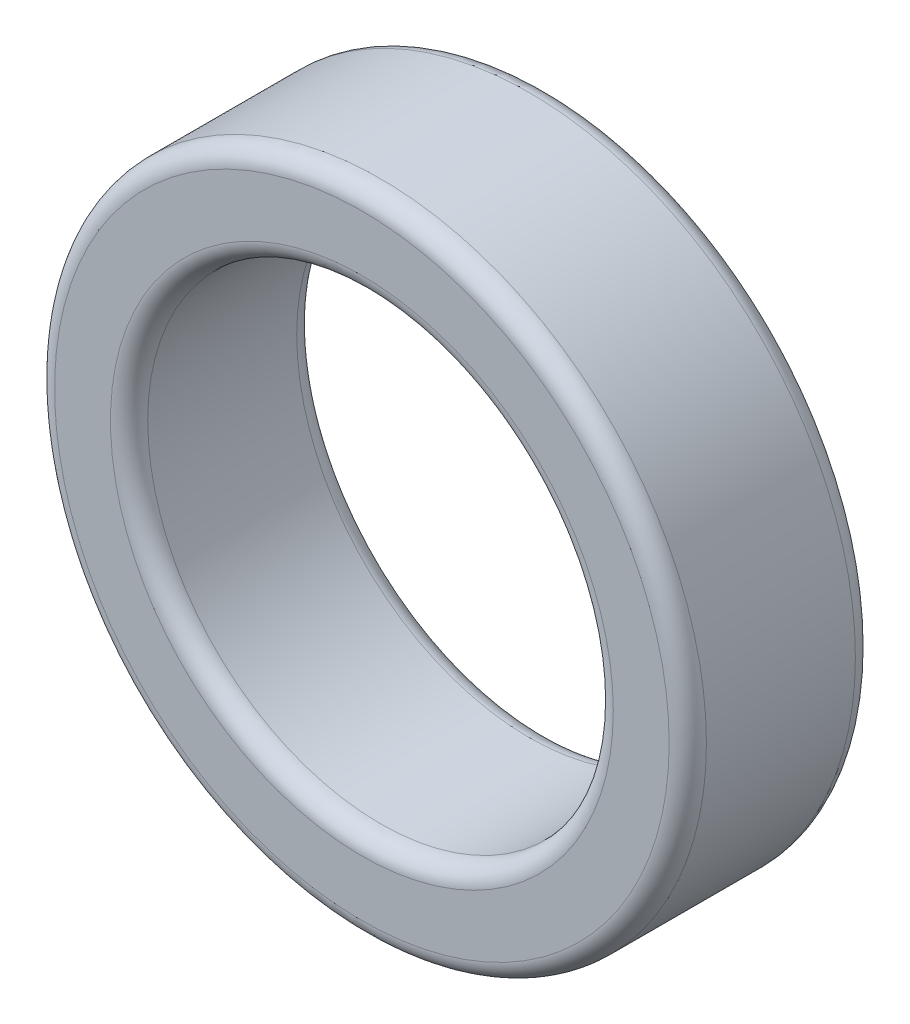
ISO-10303-21;
HEADER;
FILE_DESCRIPTION(('STEP AP214'),'2;1');
FILE_NAME('part.step','',(''),(''),'','','');
FILE_SCHEMA(('AUTOMOTIVE_DESIGN { 1 0 10303 214 1 1 1 1 }'));
ENDSEC;
DATA;
#1=APPLICATION_CONTEXT('core data for automotive mechanical design processes');
#2=APPLICATION_PROTOCOL_DEFINITION('international standard','automotive_design',2000,#1);
#3=PRODUCT_CONTEXT('',#1,'mechanical');
#4=PRODUCT('Part','Part','',(#3));
#5=PRODUCT_RELATED_PRODUCT_CATEGORY('part','',(#4));
#6=PRODUCT_DEFINITION_FORMATION('','',#4);
#7=PRODUCT_DEFINITION_CONTEXT('part definition',#1,'design');
#8=PRODUCT_DEFINITION('design','',#6,#7);
#9=PRODUCT_DEFINITION_SHAPE('','',#8);
#10=(LENGTH_UNIT() NAMED_UNIT(*) SI_UNIT(.MILLI.,.METRE.));
#11=(NAMED_UNIT(*) PLANE_ANGLE_UNIT() SI_UNIT($,.RADIAN.));
#12=(NAMED_UNIT(*) SI_UNIT($,.STERADIAN.) SOLID_ANGLE_UNIT());
#13=UNCERTAINTY_MEASURE_WITH_UNIT(LENGTH_MEASURE(1.E-05),#10,'distance_accuracy_value','');
#14=(GEOMETRIC_REPRESENTATION_CONTEXT(3) GLOBAL_UNCERTAINTY_ASSIGNED_CONTEXT((#13)) GLOBAL_UNIT_ASSIGNED_CONTEXT((#10,
#11,#12)) REPRESENTATION_CONTEXT('',''));
#15=CARTESIAN_POINT('',(0.,0.,0.));
#16=DIRECTION('',(0.,0.,1.));
#17=DIRECTION('',(1.,0.,0.));
#18=AXIS2_PLACEMENT_3D('',#15,#16,#17);
#19=CARTESIAN_POINT('',(0.,0.,20.));
#20=DIRECTION('',(0.,0.,1.));
#21=DIRECTION('',(1.,0.,0.));
#22=AXIS2_PLACEMENT_3D('',#19,#20,#21);
#23=PLANE('',#22);
#24=CARTESIAN_POINT('',(0.,0.,20.));
#25=DIRECTION('',(0.,0.,1.));
#26=DIRECTION('',(1.,0.,0.));
#27=AXIS2_PLACEMENT_3D('',#24,#25,#26);
#28=CIRCLE('',#27,27.);
#29=CARTESIAN_POINT('',(27.,0.,20.));
#30=VERTEX_POINT('',#29);
#31=EDGE_CURVE('E10',#30,#30,#28,.F.);
#32=ORIENTED_EDGE('',*,*,#31,.T.);
#33=EDGE_LOOP('',(#32));
#34=FACE_BOUND('',#33,.T.);
#35=CARTESIAN_POINT('',(0.,0.,20.));
#36=DIRECTION('',(0.,0.,1.));
#37=DIRECTION('',(1.,0.,0.));
#38=AXIS2_PLACEMENT_3D('',#35,#36,#37);
#39=CIRCLE('',#38,33.);
#40=CARTESIAN_POINT('',(33.,0.,20.));
#41=VERTEX_POINT('',#40);
#42=EDGE_CURVE('E38',#41,#41,#39,.T.);
#43=ORIENTED_EDGE('',*,*,#42,.T.);
#44=EDGE_LOOP('',(#43));
#45=FACE_BOUND('',#44,.T.);
#46=ADVANCED_FACE('F31',(#34,#45),#23,.T.);
#47=CARTESIAN_POINT('',(0.,0.,0.));
#48=DIRECTION('',(0.,0.,1.));
#49=DIRECTION('',(1.,0.,0.));
#50=AXIS2_PLACEMENT_3D('',#47,#48,#49);
#51=PLANE('',#50);
#52=CARTESIAN_POINT('',(0.,0.,0.));
#53=DIRECTION('',(0.,0.,1.));
#54=DIRECTION('',(1.,0.,0.));
#55=AXIS2_PLACEMENT_3D('',#52,#53,#54);
#56=CIRCLE('',#55,33.);
#57=CARTESIAN_POINT('',(33.,0.,0.));
#58=VERTEX_POINT('',#57);
#59=EDGE_CURVE('E51',#58,#58,#56,.F.);
#60=ORIENTED_EDGE('',*,*,#59,.T.);
#61=EDGE_LOOP('',(#60));
#62=FACE_BOUND('',#61,.T.);
#63=CARTESIAN_POINT('',(0.,0.,0.));
#64=DIRECTION('',(0.,0.,1.));
#65=DIRECTION('',(1.,0.,0.));
#66=AXIS2_PLACEMENT_3D('',#63,#64,#65);
#67=CIRCLE('',#66,27.);
#68=CARTESIAN_POINT('',(27.,0.,0.));
#69=VERTEX_POINT('',#68);
#70=EDGE_CURVE('E54',#69,#69,#67,.T.);
#71=ORIENTED_EDGE('',*,*,#70,.T.);
#72=EDGE_LOOP('',(#71));
#73=FACE_BOUND('',#72,.T.);
#74=ADVANCED_FACE('F75',(#62,#73),#51,.F.);
#75=CARTESIAN_POINT('',(0.,0.,20.));
#76=DIRECTION('',(0.,0.,-1.));
#77=DIRECTION('',(-1.,0.,0.));
#78=AXIS2_PLACEMENT_3D('',#75,#76,#77);
#79=CYLINDRICAL_SURFACE('',#78,35.);
#80=CARTESIAN_POINT('',(0.,0.,2.));
#81=DIRECTION('',(0.,0.,1.));
#82=DIRECTION('',(1.,0.,0.));
#83=AXIS2_PLACEMENT_3D('',#80,#81,#82);
#84=CIRCLE('',#83,35.);
#85=CARTESIAN_POINT('',(35.,0.,2.));
#86=VERTEX_POINT('',#85);
#87=EDGE_CURVE('E57',#86,#86,#84,.T.);
#88=ORIENTED_EDGE('',*,*,#87,.T.);
#89=EDGE_LOOP('',(#88));
#90=FACE_BOUND('',#89,.T.);
#91=CARTESIAN_POINT('',(0.,0.,18.));
#92=DIRECTION('',(0.,0.,1.));
#93=DIRECTION('',(1.,0.,0.));
#94=AXIS2_PLACEMENT_3D('',#91,#92,#93);
#95=CIRCLE('',#94,35.);
#96=CARTESIAN_POINT('',(35.,0.,18.));
#97=VERTEX_POINT('',#96);
#98=EDGE_CURVE('E60',#97,#97,#95,.F.);
#99=ORIENTED_EDGE('',*,*,#98,.T.);
#100=EDGE_LOOP('',(#99));
#101=FACE_BOUND('',#100,.T.);
#102=ADVANCED_FACE('F64',(#90,#101),#79,.T.);
#103=CARTESIAN_POINT('',(0.,0.,20.));
#104=DIRECTION('',(0.,0.,-1.));
#105=DIRECTION('',(-1.,0.,0.));
#106=AXIS2_PLACEMENT_3D('',#103,#104,#105);
#107=CYLINDRICAL_SURFACE('',#106,25.);
#108=CARTESIAN_POINT('',(0.,0.,2.));
#109=DIRECTION('',(0.,0.,1.));
#110=DIRECTION('',(1.,0.,0.));
#111=AXIS2_PLACEMENT_3D('',#108,#109,#110);
#112=CIRCLE('',#111,25.);
#113=CARTESIAN_POINT('',(25.,0.,2.));
#114=VERTEX_POINT('',#113);
#115=EDGE_CURVE('E42',#114,#114,#112,.F.);
#116=ORIENTED_EDGE('',*,*,#115,.T.);
#117=EDGE_LOOP('',(#116));
#118=FACE_BOUND('',#117,.T.);
#119=CARTESIAN_POINT('',(0.,0.,18.));
#120=DIRECTION('',(0.,0.,1.));
#121=DIRECTION('',(1.,0.,0.));
#122=AXIS2_PLACEMENT_3D('',#119,#120,#121);
#123=CIRCLE('',#122,25.);
#124=CARTESIAN_POINT('',(25.,0.,18.));
#125=VERTEX_POINT('',#124);
#126=EDGE_CURVE('E46',#125,#125,#123,.T.);
#127=ORIENTED_EDGE('',*,*,#126,.T.);
#128=EDGE_LOOP('',(#127));
#129=FACE_BOUND('',#128,.T.);
#130=ADVANCED_FACE('F83',(#118,#129),#107,.F.);
#131=CARTESIAN_POINT('',(0.,0.,2.));
#132=DIRECTION('',(0.,0.,1.));
#133=DIRECTION('',(1.,0.,0.));
#134=AXIS2_PLACEMENT_3D('',#131,#132,#133);
#135=TOROIDAL_SURFACE('',#134,33.,2.);
#136=ORIENTED_EDGE('',*,*,#59,.F.);
#137=EDGE_LOOP('',(#136));
#138=FACE_BOUND('',#137,.T.);
#139=ORIENTED_EDGE('',*,*,#87,.F.);
#140=EDGE_LOOP('',(#139));
#141=FACE_BOUND('',#140,.T.);
#142=ADVANCED_FACE('F88',(#138,#141),#135,.T.);
#143=CARTESIAN_POINT('',(0.,0.,2.));
#144=DIRECTION('',(0.,0.,1.));
#145=DIRECTION('',(1.,0.,0.));
#146=AXIS2_PLACEMENT_3D('',#143,#144,#145);
#147=TOROIDAL_SURFACE('',#146,27.,2.);
#148=ORIENTED_EDGE('',*,*,#115,.F.);
#149=EDGE_LOOP('',(#148));
#150=FACE_BOUND('',#149,.T.);
#151=ORIENTED_EDGE('',*,*,#70,.F.);
#152=EDGE_LOOP('',(#151));
#153=FACE_BOUND('',#152,.T.);
#154=ADVANCED_FACE('F72',(#150,#153),#147,.T.);
#155=CARTESIAN_POINT('',(0.,0.,18.));
#156=DIRECTION('',(0.,0.,1.));
#157=DIRECTION('',(1.,0.,0.));
#158=AXIS2_PLACEMENT_3D('',#155,#156,#157);
#159=TOROIDAL_SURFACE('',#158,27.,2.);
#160=ORIENTED_EDGE('',*,*,#31,.F.);
#161=EDGE_LOOP('',(#160));
#162=FACE_BOUND('',#161,.T.);
#163=ORIENTED_EDGE('',*,*,#126,.F.);
#164=EDGE_LOOP('',(#163));
#165=FACE_BOUND('',#164,.T.);
#166=ADVANCED_FACE('F68',(#162,#165),#159,.T.);
#167=CARTESIAN_POINT('',(0.,0.,18.));
#168=DIRECTION('',(0.,0.,1.));
#169=DIRECTION('',(1.,0.,0.));
#170=AXIS2_PLACEMENT_3D('',#167,#168,#169);
#171=TOROIDAL_SURFACE('',#170,33.,2.);
#172=ORIENTED_EDGE('',*,*,#98,.F.);
#173=EDGE_LOOP('',(#172));
#174=FACE_BOUND('',#173,.T.);
#175=ORIENTED_EDGE('',*,*,#42,.F.);
#176=EDGE_LOOP('',(#175));
#177=FACE_BOUND('',#176,.T.);
#178=ADVANCED_FACE('F33',(#174,#177),#171,.T.);
#179=CLOSED_SHELL('',(#46,#74,#102,#130,#142,#154,#166,#178));
#180=MANIFOLD_SOLID_BREP('B2',#179);
#181=ADVANCED_BREP_SHAPE_REPRESENTATION('',(#18,#180),#14);
#182=SHAPE_DEFINITION_REPRESENTATION(#9,#181);
ENDSEC;
END-ISO-10303-21;
